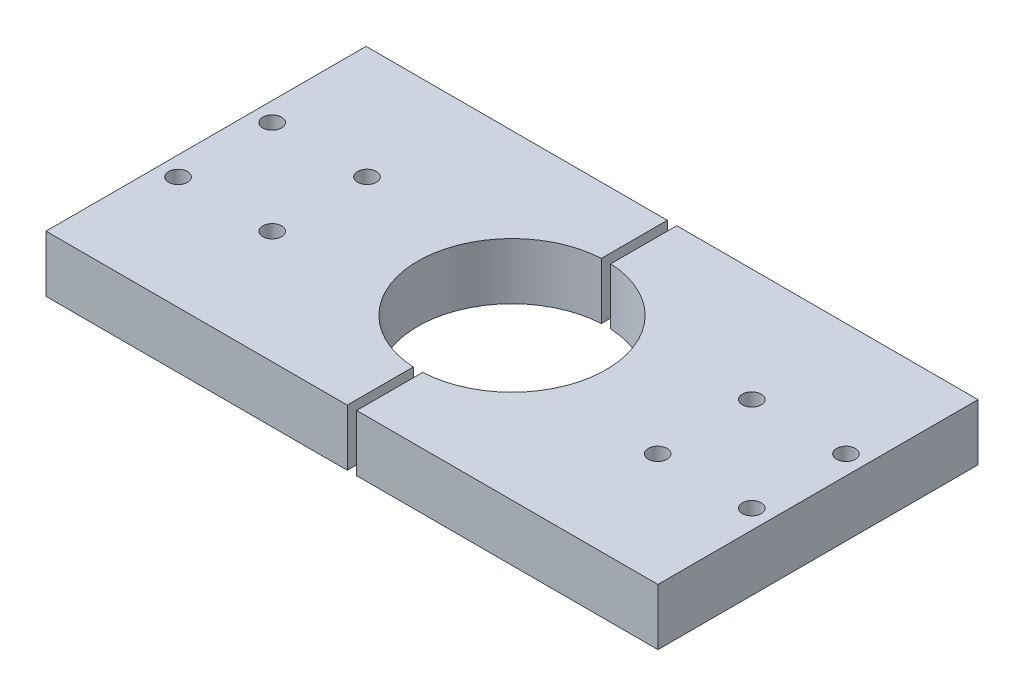
ISO-10303-21;
HEADER;
FILE_DESCRIPTION(('STEP AP214'),'2;1');
FILE_NAME('part.step','',(''),(''),'','','');
FILE_SCHEMA(('AUTOMOTIVE_DESIGN { 1 0 10303 214 1 1 1 1 }'));
ENDSEC;
DATA;
#1=APPLICATION_CONTEXT('core data for automotive mechanical design processes');
#2=APPLICATION_PROTOCOL_DEFINITION('international standard','automotive_design',2000,#1);
#3=PRODUCT_CONTEXT('',#1,'mechanical');
#4=PRODUCT('Part','Part','',(#3));
#5=PRODUCT_RELATED_PRODUCT_CATEGORY('part','',(#4));
#6=PRODUCT_DEFINITION_FORMATION('','',#4);
#7=PRODUCT_DEFINITION_CONTEXT('part definition',#1,'design');
#8=PRODUCT_DEFINITION('design','',#6,#7);
#9=PRODUCT_DEFINITION_SHAPE('','',#8);
#10=(LENGTH_UNIT() NAMED_UNIT(*) SI_UNIT(.MILLI.,.METRE.));
#11=(NAMED_UNIT(*) PLANE_ANGLE_UNIT() SI_UNIT($,.RADIAN.));
#12=(NAMED_UNIT(*) SI_UNIT($,.STERADIAN.) SOLID_ANGLE_UNIT());
#13=UNCERTAINTY_MEASURE_WITH_UNIT(LENGTH_MEASURE(1.E-05),#10,'distance_accuracy_value','');
#14=(GEOMETRIC_REPRESENTATION_CONTEXT(3) GLOBAL_UNCERTAINTY_ASSIGNED_CONTEXT((#13)) GLOBAL_UNIT_ASSIGNED_CONTEXT((#10,
#11,#12)) REPRESENTATION_CONTEXT('',''));
#15=CARTESIAN_POINT('',(0.,0.,0.));
#16=DIRECTION('',(0.,0.,1.));
#17=DIRECTION('',(1.,0.,0.));
#18=AXIS2_PLACEMENT_3D('',#15,#16,#17);
#19=CARTESIAN_POINT('',(65.001,6.,27.));
#20=DIRECTION('',(-1.,0.,0.));
#21=DIRECTION('',(0.,0.,1.));
#22=AXIS2_PLACEMENT_3D('',#19,#20,#21);
#23=CYLINDRICAL_SURFACE('',#22,2.99999999999999);
#24=CARTESIAN_POINT('',(-1.,6.,27.));
#25=DIRECTION('',(-1.,0.,0.));
#26=DIRECTION('',(0.,0.,1.));
#27=AXIS2_PLACEMENT_3D('',#24,#25,#26);
#28=CIRCLE('',#27,2.99999999999999);
#29=CARTESIAN_POINT('',(-1.,6.,30.));
#30=VERTEX_POINT('',#29);
#31=EDGE_CURVE('E159',#30,#30,#28,.F.);
#32=ORIENTED_EDGE('',*,*,#31,.T.);
#33=EDGE_LOOP('',(#32));
#34=FACE_BOUND('',#33,.T.);
#35=CARTESIAN_POINT('',(-59.,6.,27.));
#36=DIRECTION('',(-1.,0.,0.));
#37=DIRECTION('',(0.,0.,1.));
#38=AXIS2_PLACEMENT_3D('',#35,#36,#37);
#39=CIRCLE('',#38,2.99999999999999);
#40=CARTESIAN_POINT('',(-59.,6.,30.));
#41=VERTEX_POINT('',#40);
#42=EDGE_CURVE('E54',#41,#41,#39,.F.);
#43=ORIENTED_EDGE('',*,*,#42,.F.);
#44=EDGE_LOOP('',(#43));
#45=FACE_BOUND('',#44,.T.);
#46=ADVANCED_FACE('F50',(#34,#45),#23,.F.);
#47=CARTESIAN_POINT('',(65.001,6.,-27.));
#48=DIRECTION('',(-1.,0.,0.));
#49=DIRECTION('',(0.,0.,1.));
#50=AXIS2_PLACEMENT_3D('',#47,#48,#49);
#51=CYLINDRICAL_SURFACE('',#50,2.99999999999999);
#52=CARTESIAN_POINT('',(-1.,6.,-27.));
#53=DIRECTION('',(-1.,0.,0.));
#54=DIRECTION('',(0.,0.,1.));
#55=AXIS2_PLACEMENT_3D('',#52,#53,#54);
#56=CIRCLE('',#55,2.99999999999999);
#57=CARTESIAN_POINT('',(-1.,6.,-24.));
#58=VERTEX_POINT('',#57);
#59=EDGE_CURVE('E178',#58,#58,#56,.F.);
#60=ORIENTED_EDGE('',*,*,#59,.T.);
#61=EDGE_LOOP('',(#60));
#62=FACE_BOUND('',#61,.T.);
#63=CARTESIAN_POINT('',(-59.,6.,-27.));
#64=DIRECTION('',(-1.,0.,0.));
#65=DIRECTION('',(0.,0.,1.));
#66=AXIS2_PLACEMENT_3D('',#63,#64,#65);
#67=CIRCLE('',#66,2.99999999999999);
#68=CARTESIAN_POINT('',(-59.,6.,-24.));
#69=VERTEX_POINT('',#68);
#70=EDGE_CURVE('E149',#69,#69,#67,.F.);
#71=ORIENTED_EDGE('',*,*,#70,.F.);
#72=EDGE_LOOP('',(#71));
#73=FACE_BOUND('',#72,.T.);
#74=ADVANCED_FACE('F270',(#62,#73),#51,.F.);
#75=CARTESIAN_POINT('',(-1.,12.,34.));
#76=DIRECTION('',(-1.,0.,0.));
#77=DIRECTION('',(0.,0.,1.));
#78=AXIS2_PLACEMENT_3D('',#75,#76,#77);
#79=PLANE('',#78);
#80=ORIENTED_EDGE('',*,*,#59,.F.);
#81=EDGE_LOOP('',(#80));
#82=FACE_BOUND('',#81,.T.);
#83=DIRECTION('',(0.,-1.,0.));
#84=VECTOR('',#83,1.);
#85=CARTESIAN_POINT('',(-1.,12.,-19.9749843554382));
#86=LINE('',#85,#84);
#87=CARTESIAN_POINT('',(-1.,0.,-19.9749843554382));
#88=VERTEX_POINT('',#87);
#89=CARTESIAN_POINT('',(-1.,12.,-19.9749843554382));
#90=VERTEX_POINT('',#89);
#91=EDGE_CURVE('E114',#88,#90,#86,.F.);
#92=ORIENTED_EDGE('',*,*,#91,.F.);
#93=DIRECTION('',(0.,0.,-1.));
#94=VECTOR('',#93,1.);
#95=CARTESIAN_POINT('',(-1.,0.,34.));
#96=LINE('',#95,#94);
#97=CARTESIAN_POINT('',(-1.,0.,-34.));
#98=VERTEX_POINT('',#97);
#99=EDGE_CURVE('E233',#88,#98,#96,.T.);
#100=ORIENTED_EDGE('',*,*,#99,.T.);
#101=DIRECTION('',(0.,-1.,0.));
#102=VECTOR('',#101,1.);
#103=CARTESIAN_POINT('',(-1.,12.,-34.));
#104=LINE('',#103,#102);
#105=CARTESIAN_POINT('',(-1.,12.,-34.));
#106=VERTEX_POINT('',#105);
#107=EDGE_CURVE('E134',#106,#98,#104,.T.);
#108=ORIENTED_EDGE('',*,*,#107,.F.);
#109=DIRECTION('',(0.,0.,-1.));
#110=VECTOR('',#109,1.);
#111=CARTESIAN_POINT('',(-1.,12.,34.));
#112=LINE('',#111,#110);
#113=EDGE_CURVE('E127',#90,#106,#112,.T.);
#114=ORIENTED_EDGE('',*,*,#113,.F.);
#115=EDGE_LOOP('',(#92,#100,#108,#114));
#116=FACE_BOUND('',#115,.T.);
#117=ADVANCED_FACE('F133',(#82,#116),#79,.F.);
#118=ORIENTED_EDGE('',*,*,#31,.F.);
#119=EDGE_LOOP('',(#118));
#120=FACE_BOUND('',#119,.T.);
#121=DIRECTION('',(0.,-1.,0.));
#122=VECTOR('',#121,1.);
#123=CARTESIAN_POINT('',(-1.,12.,19.9749843554382));
#124=LINE('',#123,#122);
#125=CARTESIAN_POINT('',(-1.,12.,19.9749843554382));
#126=VERTEX_POINT('',#125);
#127=CARTESIAN_POINT('',(-1.,0.,19.9749843554382));
#128=VERTEX_POINT('',#127);
#129=EDGE_CURVE('E68',#126,#128,#124,.T.);
#130=ORIENTED_EDGE('',*,*,#129,.F.);
#131=CARTESIAN_POINT('',(-1.,12.,34.));
#132=VERTEX_POINT('',#131);
#133=EDGE_CURVE('E130',#132,#126,#112,.T.);
#134=ORIENTED_EDGE('',*,*,#133,.F.);
#135=DIRECTION('',(0.,-1.,0.));
#136=VECTOR('',#135,1.);
#137=CARTESIAN_POINT('',(-1.,12.,34.));
#138=LINE('',#137,#136);
#139=CARTESIAN_POINT('',(-1.,0.,34.));
#140=VERTEX_POINT('',#139);
#141=EDGE_CURVE('E223',#132,#140,#138,.T.);
#142=ORIENTED_EDGE('',*,*,#141,.T.);
#143=EDGE_CURVE('E234',#140,#128,#96,.T.);
#144=ORIENTED_EDGE('',*,*,#143,.T.);
#145=EDGE_LOOP('',(#130,#134,#142,#144));
#146=FACE_BOUND('',#145,.T.);
#147=ADVANCED_FACE('F243',(#120,#146),#79,.F.);
#148=CARTESIAN_POINT('',(-65.,12.,34.));
#149=DIRECTION('',(1.,0.,0.));
#150=DIRECTION('',(0.,0.,-1.));
#151=AXIS2_PLACEMENT_3D('',#148,#149,#150);
#152=PLANE('',#151);
#153=CARTESIAN_POINT('',(-65.,6.,-27.));
#154=DIRECTION('',(-1.,0.,0.));
#155=DIRECTION('',(0.,0.,1.));
#156=AXIS2_PLACEMENT_3D('',#153,#154,#155);
#157=CIRCLE('',#156,5.);
#158=CARTESIAN_POINT('',(-65.,6.,-22.));
#159=VERTEX_POINT('',#158);
#160=EDGE_CURVE('E161',#159,#159,#157,.T.);
#161=ORIENTED_EDGE('',*,*,#160,.F.);
#162=EDGE_LOOP('',(#161));
#163=FACE_BOUND('',#162,.T.);
#164=CARTESIAN_POINT('',(-65.,6.,27.));
#165=DIRECTION('',(-1.,0.,0.));
#166=DIRECTION('',(0.,0.,1.));
#167=AXIS2_PLACEMENT_3D('',#164,#165,#166);
#168=CIRCLE('',#167,5.);
#169=CARTESIAN_POINT('',(-65.,6.,32.));
#170=VERTEX_POINT('',#169);
#171=EDGE_CURVE('E168',#170,#170,#168,.T.);
#172=ORIENTED_EDGE('',*,*,#171,.F.);
#173=EDGE_LOOP('',(#172));
#174=FACE_BOUND('',#173,.T.);
#175=DIRECTION('',(0.,0.,1.));
#176=VECTOR('',#175,1.);
#177=CARTESIAN_POINT('',(-65.,0.,34.));
#178=LINE('',#177,#176);
#179=CARTESIAN_POINT('',(-65.,0.,-34.));
#180=VERTEX_POINT('',#179);
#181=CARTESIAN_POINT('',(-65.,0.,34.));
#182=VERTEX_POINT('',#181);
#183=EDGE_CURVE('E12',#180,#182,#178,.T.);
#184=ORIENTED_EDGE('',*,*,#183,.T.);
#185=DIRECTION('',(0.,-1.,0.));
#186=VECTOR('',#185,1.);
#187=CARTESIAN_POINT('',(-65.,12.,34.));
#188=LINE('',#187,#186);
#189=CARTESIAN_POINT('',(-65.,12.,34.));
#190=VERTEX_POINT('',#189);
#191=EDGE_CURVE('E123',#190,#182,#188,.T.);
#192=ORIENTED_EDGE('',*,*,#191,.F.);
#193=DIRECTION('',(0.,0.,1.));
#194=VECTOR('',#193,1.);
#195=CARTESIAN_POINT('',(-65.,12.,34.));
#196=LINE('',#195,#194);
#197=CARTESIAN_POINT('',(-65.,12.,-34.));
#198=VERTEX_POINT('',#197);
#199=EDGE_CURVE('E147',#198,#190,#196,.T.);
#200=ORIENTED_EDGE('',*,*,#199,.F.);
#201=DIRECTION('',(0.,-1.,0.));
#202=VECTOR('',#201,1.);
#203=CARTESIAN_POINT('',(-65.,12.,-34.));
#204=LINE('',#203,#202);
#205=EDGE_CURVE('E142',#198,#180,#204,.T.);
#206=ORIENTED_EDGE('',*,*,#205,.T.);
#207=EDGE_LOOP('',(#184,#192,#200,#206));
#208=FACE_BOUND('',#207,.T.);
#209=ADVANCED_FACE('F255',(#163,#174,#208),#152,.F.);
#210=CARTESIAN_POINT('',(-65.,12.,34.));
#211=DIRECTION('',(0.,0.,-1.));
#212=DIRECTION('',(-1.,0.,0.));
#213=AXIS2_PLACEMENT_3D('',#210,#211,#212);
#214=PLANE('',#213);
#215=DIRECTION('',(1.,0.,0.));
#216=VECTOR('',#215,1.);
#217=CARTESIAN_POINT('',(-65.,0.,34.));
#218=LINE('',#217,#216);
#219=EDGE_CURVE('E60',#182,#140,#218,.T.);
#220=ORIENTED_EDGE('',*,*,#219,.T.);
#221=ORIENTED_EDGE('',*,*,#141,.F.);
#222=DIRECTION('',(1.,0.,0.));
#223=VECTOR('',#222,1.);
#224=CARTESIAN_POINT('',(-65.,12.,34.));
#225=LINE('',#224,#223);
#226=EDGE_CURVE('E96',#190,#132,#225,.T.);
#227=ORIENTED_EDGE('',*,*,#226,.F.);
#228=ORIENTED_EDGE('',*,*,#191,.T.);
#229=EDGE_LOOP('',(#220,#221,#227,#228));
#230=FACE_BOUND('',#229,.T.);
#231=ADVANCED_FACE('F240',(#230),#214,.F.);
#232=CARTESIAN_POINT('',(-65.,12.,-34.));
#233=DIRECTION('',(0.,0.,1.));
#234=DIRECTION('',(1.,0.,0.));
#235=AXIS2_PLACEMENT_3D('',#232,#233,#234);
#236=PLANE('',#235);
#237=DIRECTION('',(-1.,0.,0.));
#238=VECTOR('',#237,1.);
#239=CARTESIAN_POINT('',(-65.,0.,-34.));
#240=LINE('',#239,#238);
#241=EDGE_CURVE('E104',#98,#180,#240,.T.);
#242=ORIENTED_EDGE('',*,*,#241,.T.);
#243=ORIENTED_EDGE('',*,*,#205,.F.);
#244=DIRECTION('',(-1.,0.,0.));
#245=VECTOR('',#244,1.);
#246=CARTESIAN_POINT('',(-65.,12.,-34.));
#247=LINE('',#246,#245);
#248=EDGE_CURVE('E137',#106,#198,#247,.T.);
#249=ORIENTED_EDGE('',*,*,#248,.F.);
#250=ORIENTED_EDGE('',*,*,#107,.T.);
#251=EDGE_LOOP('',(#242,#243,#249,#250));
#252=FACE_BOUND('',#251,.T.);
#253=ADVANCED_FACE('F252',(#252),#236,.F.);
#254=CARTESIAN_POINT('',(0.,12.,0.));
#255=DIRECTION('',(0.,-1.,0.));
#256=DIRECTION('',(0.,0.,-1.));
#257=AXIS2_PLACEMENT_3D('',#254,#255,#256);
#258=PLANE('',#257);
#259=CARTESIAN_POINT('',(-60.95,12.,10.));
#260=DIRECTION('',(0.,1.,0.));
#261=DIRECTION('',(0.,0.,1.));
#262=AXIS2_PLACEMENT_3D('',#259,#260,#261);
#263=CIRCLE('',#262,2.);
#264=CARTESIAN_POINT('',(-60.95,12.,12.));
#265=VERTEX_POINT('',#264);
#266=EDGE_CURVE('E203',#265,#265,#263,.T.);
#267=ORIENTED_EDGE('',*,*,#266,.F.);
#268=EDGE_LOOP('',(#267));
#269=FACE_BOUND('',#268,.T.);
#270=CARTESIAN_POINT('',(-40.95,12.,10.));
#271=DIRECTION('',(0.,1.,0.));
#272=DIRECTION('',(0.,0.,1.));
#273=AXIS2_PLACEMENT_3D('',#270,#271,#272);
#274=CIRCLE('',#273,2.);
#275=CARTESIAN_POINT('',(-40.95,12.,12.));
#276=VERTEX_POINT('',#275);
#277=EDGE_CURVE('E195',#276,#276,#274,.T.);
#278=ORIENTED_EDGE('',*,*,#277,.F.);
#279=EDGE_LOOP('',(#278));
#280=FACE_BOUND('',#279,.T.);
#281=CARTESIAN_POINT('',(-40.8891771545705,12.,-10.082916262143));
#282=DIRECTION('',(0.,1.,0.));
#283=DIRECTION('',(0.,0.,1.));
#284=AXIS2_PLACEMENT_3D('',#281,#282,#283);
#285=CIRCLE('',#284,2.);
#286=CARTESIAN_POINT('',(-40.8891771545705,12.,-8.08291626214301));
#287=VERTEX_POINT('',#286);
#288=EDGE_CURVE('E186',#287,#287,#285,.T.);
#289=ORIENTED_EDGE('',*,*,#288,.F.);
#290=EDGE_LOOP('',(#289));
#291=FACE_BOUND('',#290,.T.);
#292=CARTESIAN_POINT('',(-60.95,12.,-10.));
#293=DIRECTION('',(0.,1.,0.));
#294=DIRECTION('',(0.,0.,1.));
#295=AXIS2_PLACEMENT_3D('',#292,#293,#294);
#296=CIRCLE('',#295,2.);
#297=CARTESIAN_POINT('',(-60.95,12.,-8.));
#298=VERTEX_POINT('',#297);
#299=EDGE_CURVE('E190',#298,#298,#296,.T.);
#300=ORIENTED_EDGE('',*,*,#299,.F.);
#301=EDGE_LOOP('',(#300));
#302=FACE_BOUND('',#301,.T.);
#303=CARTESIAN_POINT('',(0.,12.,0.));
#304=DIRECTION('',(0.,1.,0.));
#305=DIRECTION('',(0.,0.,1.));
#306=AXIS2_PLACEMENT_3D('',#303,#304,#305);
#307=CIRCLE('',#306,20.);
#308=EDGE_CURVE('E117',#90,#126,#307,.T.);
#309=ORIENTED_EDGE('',*,*,#308,.F.);
#310=ORIENTED_EDGE('',*,*,#113,.T.);
#311=ORIENTED_EDGE('',*,*,#248,.T.);
#312=ORIENTED_EDGE('',*,*,#199,.T.);
#313=ORIENTED_EDGE('',*,*,#226,.T.);
#314=ORIENTED_EDGE('',*,*,#133,.T.);
#315=EDGE_LOOP('',(#309,#310,#311,#312,#313,#314));
#316=FACE_BOUND('',#315,.T.);
#317=ADVANCED_FACE('F52',(#269,#280,#291,#302,#316),#258,.F.);
#318=CARTESIAN_POINT('',(0.,0.,0.));
#319=DIRECTION('',(0.,-1.,0.));
#320=DIRECTION('',(0.,0.,-1.));
#321=AXIS2_PLACEMENT_3D('',#318,#319,#320);
#322=PLANE('',#321);
#323=CARTESIAN_POINT('',(-60.95,0.,10.));
#324=DIRECTION('',(0.,1.,0.));
#325=DIRECTION('',(0.,0.,1.));
#326=AXIS2_PLACEMENT_3D('',#323,#324,#325);
#327=CIRCLE('',#326,2.);
#328=CARTESIAN_POINT('',(-60.95,0.,12.));
#329=VERTEX_POINT('',#328);
#330=EDGE_CURVE('E182',#329,#329,#327,.T.);
#331=ORIENTED_EDGE('',*,*,#330,.T.);
#332=EDGE_LOOP('',(#331));
#333=FACE_BOUND('',#332,.T.);
#334=CARTESIAN_POINT('',(-40.95,0.,10.));
#335=DIRECTION('',(0.,1.,0.));
#336=DIRECTION('',(0.,0.,1.));
#337=AXIS2_PLACEMENT_3D('',#334,#335,#336);
#338=CIRCLE('',#337,2.);
#339=CARTESIAN_POINT('',(-40.95,0.,12.));
#340=VERTEX_POINT('',#339);
#341=EDGE_CURVE('E199',#340,#340,#338,.T.);
#342=ORIENTED_EDGE('',*,*,#341,.T.);
#343=EDGE_LOOP('',(#342));
#344=FACE_BOUND('',#343,.T.);
#345=CARTESIAN_POINT('',(-40.8891771545705,0.,-10.082916262143));
#346=DIRECTION('',(0.,1.,0.));
#347=DIRECTION('',(0.,0.,1.));
#348=AXIS2_PLACEMENT_3D('',#345,#346,#347);
#349=CIRCLE('',#348,2.);
#350=CARTESIAN_POINT('',(-40.8891771545705,0.,-8.08291626214301));
#351=VERTEX_POINT('',#350);
#352=EDGE_CURVE('E191',#351,#351,#349,.T.);
#353=ORIENTED_EDGE('',*,*,#352,.T.);
#354=EDGE_LOOP('',(#353));
#355=FACE_BOUND('',#354,.T.);
#356=CARTESIAN_POINT('',(-60.95,0.,-10.));
#357=DIRECTION('',(0.,1.,0.));
#358=DIRECTION('',(0.,0.,1.));
#359=AXIS2_PLACEMENT_3D('',#356,#357,#358);
#360=CIRCLE('',#359,2.);
#361=CARTESIAN_POINT('',(-60.95,0.,-8.));
#362=VERTEX_POINT('',#361);
#363=EDGE_CURVE('E210',#362,#362,#360,.T.);
#364=ORIENTED_EDGE('',*,*,#363,.T.);
#365=EDGE_LOOP('',(#364));
#366=FACE_BOUND('',#365,.T.);
#367=ORIENTED_EDGE('',*,*,#99,.F.);
#368=CARTESIAN_POINT('',(0.,0.,0.));
#369=DIRECTION('',(0.,1.,0.));
#370=DIRECTION('',(0.,0.,1.));
#371=AXIS2_PLACEMENT_3D('',#368,#369,#370);
#372=CIRCLE('',#371,20.);
#373=EDGE_CURVE('E118',#88,#128,#372,.T.);
#374=ORIENTED_EDGE('',*,*,#373,.T.);
#375=ORIENTED_EDGE('',*,*,#143,.F.);
#376=ORIENTED_EDGE('',*,*,#219,.F.);
#377=ORIENTED_EDGE('',*,*,#183,.F.);
#378=ORIENTED_EDGE('',*,*,#241,.F.);
#379=EDGE_LOOP('',(#367,#374,#375,#376,#377,#378));
#380=FACE_BOUND('',#379,.T.);
#381=ADVANCED_FACE('F244',(#333,#344,#355,#366,#380),#322,.T.);
#382=CARTESIAN_POINT('',(0.,12.,0.));
#383=DIRECTION('',(0.,-1.,0.));
#384=DIRECTION('',(0.,0.,-1.));
#385=AXIS2_PLACEMENT_3D('',#382,#383,#384);
#386=CYLINDRICAL_SURFACE('',#385,20.);
#387=ORIENTED_EDGE('',*,*,#91,.T.);
#388=ORIENTED_EDGE('',*,*,#308,.T.);
#389=ORIENTED_EDGE('',*,*,#129,.T.);
#390=ORIENTED_EDGE('',*,*,#373,.F.);
#391=EDGE_LOOP('',(#387,#388,#389,#390));
#392=FACE_BOUND('',#391,.T.);
#393=ADVANCED_FACE('F116',(#392),#386,.F.);
#394=CARTESIAN_POINT('',(-60.95,0.,-10.));
#395=DIRECTION('',(0.,1.,0.));
#396=DIRECTION('',(0.,0.,1.));
#397=AXIS2_PLACEMENT_3D('',#394,#395,#396);
#398=CYLINDRICAL_SURFACE('',#397,2.);
#399=ORIENTED_EDGE('',*,*,#363,.F.);
#400=EDGE_LOOP('',(#399));
#401=FACE_BOUND('',#400,.T.);
#402=ORIENTED_EDGE('',*,*,#299,.T.);
#403=EDGE_LOOP('',(#402));
#404=FACE_BOUND('',#403,.T.);
#405=ADVANCED_FACE('F285',(#401,#404),#398,.F.);
#406=CARTESIAN_POINT('',(-40.8891771545705,0.,-10.082916262143));
#407=DIRECTION('',(0.,1.,0.));
#408=DIRECTION('',(0.,0.,1.));
#409=AXIS2_PLACEMENT_3D('',#406,#407,#408);
#410=CYLINDRICAL_SURFACE('',#409,2.);
#411=ORIENTED_EDGE('',*,*,#352,.F.);
#412=EDGE_LOOP('',(#411));
#413=FACE_BOUND('',#412,.T.);
#414=ORIENTED_EDGE('',*,*,#288,.T.);
#415=EDGE_LOOP('',(#414));
#416=FACE_BOUND('',#415,.T.);
#417=ADVANCED_FACE('F281',(#413,#416),#410,.F.);
#418=CARTESIAN_POINT('',(-40.95,0.,10.));
#419=DIRECTION('',(0.,1.,0.));
#420=DIRECTION('',(0.,0.,1.));
#421=AXIS2_PLACEMENT_3D('',#418,#419,#420);
#422=CYLINDRICAL_SURFACE('',#421,2.);
#423=ORIENTED_EDGE('',*,*,#341,.F.);
#424=EDGE_LOOP('',(#423));
#425=FACE_BOUND('',#424,.T.);
#426=ORIENTED_EDGE('',*,*,#277,.T.);
#427=EDGE_LOOP('',(#426));
#428=FACE_BOUND('',#427,.T.);
#429=ADVANCED_FACE('F284',(#425,#428),#422,.F.);
#430=CARTESIAN_POINT('',(-60.95,0.,10.));
#431=DIRECTION('',(0.,1.,0.));
#432=DIRECTION('',(0.,0.,1.));
#433=AXIS2_PLACEMENT_3D('',#430,#431,#432);
#434=CYLINDRICAL_SURFACE('',#433,2.);
#435=ORIENTED_EDGE('',*,*,#330,.F.);
#436=EDGE_LOOP('',(#435));
#437=FACE_BOUND('',#436,.T.);
#438=ORIENTED_EDGE('',*,*,#266,.T.);
#439=EDGE_LOOP('',(#438));
#440=FACE_BOUND('',#439,.T.);
#441=ADVANCED_FACE('F289',(#437,#440),#434,.F.);
#442=CARTESIAN_POINT('',(-59.,6.,-27.));
#443=DIRECTION('',(-1.,0.,0.));
#444=DIRECTION('',(0.,0.,1.));
#445=AXIS2_PLACEMENT_3D('',#442,#443,#444);
#446=PLANE('',#445);
#447=CARTESIAN_POINT('',(-59.,6.,-27.));
#448=DIRECTION('',(-1.,0.,0.));
#449=DIRECTION('',(0.,0.,1.));
#450=AXIS2_PLACEMENT_3D('',#447,#448,#449);
#451=CIRCLE('',#450,5.);
#452=CARTESIAN_POINT('',(-59.,6.,-22.));
#453=VERTEX_POINT('',#452);
#454=EDGE_CURVE('E152',#453,#453,#451,.T.);
#455=ORIENTED_EDGE('',*,*,#454,.T.);
#456=EDGE_LOOP('',(#455));
#457=FACE_BOUND('',#456,.T.);
#458=ORIENTED_EDGE('',*,*,#70,.T.);
#459=EDGE_LOOP('',(#458));
#460=FACE_BOUND('',#459,.T.);
#461=ADVANCED_FACE('F293',(#457,#460),#446,.T.);
#462=CARTESIAN_POINT('',(-59.,6.,-27.));
#463=DIRECTION('',(-1.,0.,0.));
#464=DIRECTION('',(0.,0.,1.));
#465=AXIS2_PLACEMENT_3D('',#462,#463,#464);
#466=CYLINDRICAL_SURFACE('',#465,5.);
#467=ORIENTED_EDGE('',*,*,#454,.F.);
#468=EDGE_LOOP('',(#467));
#469=FACE_BOUND('',#468,.T.);
#470=ORIENTED_EDGE('',*,*,#160,.T.);
#471=EDGE_LOOP('',(#470));
#472=FACE_BOUND('',#471,.T.);
#473=ADVANCED_FACE('F348',(#469,#472),#466,.F.);
#474=CARTESIAN_POINT('',(-59.,6.,27.));
#475=DIRECTION('',(-1.,0.,0.));
#476=DIRECTION('',(0.,0.,1.));
#477=AXIS2_PLACEMENT_3D('',#474,#475,#476);
#478=PLANE('',#477);
#479=CARTESIAN_POINT('',(-59.,6.,27.));
#480=DIRECTION('',(-1.,0.,0.));
#481=DIRECTION('',(0.,0.,1.));
#482=AXIS2_PLACEMENT_3D('',#479,#480,#481);
#483=CIRCLE('',#482,5.);
#484=CARTESIAN_POINT('',(-59.,6.,32.));
#485=VERTEX_POINT('',#484);
#486=EDGE_CURVE('E174',#485,#485,#483,.T.);
#487=ORIENTED_EDGE('',*,*,#486,.T.);
#488=EDGE_LOOP('',(#487));
#489=FACE_BOUND('',#488,.T.);
#490=ORIENTED_EDGE('',*,*,#42,.T.);
#491=EDGE_LOOP('',(#490));
#492=FACE_BOUND('',#491,.T.);
#493=ADVANCED_FACE('F357',(#489,#492),#478,.T.);
#494=CARTESIAN_POINT('',(-59.,6.,27.));
#495=DIRECTION('',(-1.,0.,0.));
#496=DIRECTION('',(0.,0.,1.));
#497=AXIS2_PLACEMENT_3D('',#494,#495,#496);
#498=CYLINDRICAL_SURFACE('',#497,5.);
#499=ORIENTED_EDGE('',*,*,#486,.F.);
#500=EDGE_LOOP('',(#499));
#501=FACE_BOUND('',#500,.T.);
#502=ORIENTED_EDGE('',*,*,#171,.T.);
#503=EDGE_LOOP('',(#502));
#504=FACE_BOUND('',#503,.T.);
#505=ADVANCED_FACE('F368',(#501,#504),#498,.F.);
#506=CLOSED_SHELL('',(#46,#74,#117,#147,#209,#231,#253,#317,#381,#393,#405,#417,#429,#441,#461,
#473,#493,#505));
#507=MANIFOLD_SOLID_BREP('B2',#506);
#508=CARTESIAN_POINT('',(0.999999999999999,12.,34.));
#509=DIRECTION('',(1.,0.,0.));
#510=DIRECTION('',(0.,0.,-1.));
#511=AXIS2_PLACEMENT_3D('',#508,#509,#510);
#512=PLANE('',#511);
#513=CARTESIAN_POINT('',(0.999999999999999,6.,27.));
#514=DIRECTION('',(-1.,0.,0.));
#515=DIRECTION('',(0.,0.,-1.));
#516=AXIS2_PLACEMENT_3D('',#513,#514,#515);
#517=CIRCLE('',#516,2.5);
#518=CARTESIAN_POINT('',(0.999999999999999,6.,24.5));
#519=VERTEX_POINT('',#518);
#520=EDGE_CURVE('E718',#519,#519,#517,.T.);
#521=ORIENTED_EDGE('',*,*,#520,.F.);
#522=EDGE_LOOP('',(#521));
#523=FACE_BOUND('',#522,.T.);
#524=DIRECTION('',(0.,-1.,0.));
#525=VECTOR('',#524,1.);
#526=CARTESIAN_POINT('',(0.999999999999999,12.,19.9749843554382));
#527=LINE('',#526,#525);
#528=CARTESIAN_POINT('',(0.999999999999999,0.,19.9749843554382));
#529=VERTEX_POINT('',#528);
#530=CARTESIAN_POINT('',(0.999999999999999,12.,19.9749843554382));
#531=VERTEX_POINT('',#530);
#532=EDGE_CURVE('E573',#529,#531,#527,.F.);
#533=ORIENTED_EDGE('',*,*,#532,.F.);
#534=DIRECTION('',(0.,0.,1.));
#535=VECTOR('',#534,1.);
#536=CARTESIAN_POINT('',(0.999999999999999,0.,34.));
#537=LINE('',#536,#535);
#538=CARTESIAN_POINT('',(0.999999999999999,0.,34.));
#539=VERTEX_POINT('',#538);
#540=EDGE_CURVE('E611',#529,#539,#537,.T.);
#541=ORIENTED_EDGE('',*,*,#540,.T.);
#542=DIRECTION('',(0.,-1.,0.));
#543=VECTOR('',#542,1.);
#544=CARTESIAN_POINT('',(0.999999999999999,12.,34.));
#545=LINE('',#544,#543);
#546=CARTESIAN_POINT('',(0.999999999999999,12.,34.));
#547=VERTEX_POINT('',#546);
#548=EDGE_CURVE('E592',#547,#539,#545,.T.);
#549=ORIENTED_EDGE('',*,*,#548,.F.);
#550=DIRECTION('',(0.,0.,1.));
#551=VECTOR('',#550,1.);
#552=CARTESIAN_POINT('',(0.999999999999999,12.,34.));
#553=LINE('',#552,#551);
#554=EDGE_CURVE('E586',#531,#547,#553,.T.);
#555=ORIENTED_EDGE('',*,*,#554,.F.);
#556=EDGE_LOOP('',(#533,#541,#549,#555));
#557=FACE_BOUND('',#556,.T.);
#558=ADVANCED_FACE('F512',(#523,#557),#512,.F.);
#559=CARTESIAN_POINT('',(0.999999999999999,6.,-27.));
#560=DIRECTION('',(-1.,0.,0.));
#561=DIRECTION('',(0.,0.,1.));
#562=AXIS2_PLACEMENT_3D('',#559,#560,#561);
#563=CIRCLE('',#562,2.5);
#564=CARTESIAN_POINT('',(0.999999999999999,6.,-24.5));
#565=VERTEX_POINT('',#564);
#566=EDGE_CURVE('E709',#565,#565,#563,.T.);
#567=ORIENTED_EDGE('',*,*,#566,.F.);
#568=EDGE_LOOP('',(#567));
#569=FACE_BOUND('',#568,.T.);
#570=DIRECTION('',(0.,-1.,0.));
#571=VECTOR('',#570,1.);
#572=CARTESIAN_POINT('',(0.999999999999999,12.,-19.9749843554382));
#573=LINE('',#572,#571);
#574=CARTESIAN_POINT('',(0.999999999999999,12.,-19.9749843554382));
#575=VERTEX_POINT('',#574);
#576=CARTESIAN_POINT('',(0.999999999999999,0.,-19.9749843554382));
#577=VERTEX_POINT('',#576);
#578=EDGE_CURVE('E528',#575,#577,#573,.T.);
#579=ORIENTED_EDGE('',*,*,#578,.F.);
#580=CARTESIAN_POINT('',(0.999999999999999,12.,-34.));
#581=VERTEX_POINT('',#580);
#582=EDGE_CURVE('E589',#581,#575,#553,.T.);
#583=ORIENTED_EDGE('',*,*,#582,.F.);
#584=DIRECTION('',(0.,-1.,0.));
#585=VECTOR('',#584,1.);
#586=CARTESIAN_POINT('',(0.999999999999999,12.,-34.));
#587=LINE('',#586,#585);
#588=CARTESIAN_POINT('',(0.999999999999999,0.,-34.));
#589=VERTEX_POINT('',#588);
#590=EDGE_CURVE('E521',#581,#589,#587,.T.);
#591=ORIENTED_EDGE('',*,*,#590,.T.);
#592=EDGE_CURVE('E612',#589,#577,#537,.T.);
#593=ORIENTED_EDGE('',*,*,#592,.T.);
#594=EDGE_LOOP('',(#579,#583,#591,#593));
#595=FACE_BOUND('',#594,.T.);
#596=ADVANCED_FACE('F626',(#569,#595),#512,.F.);
#597=CARTESIAN_POINT('',(65.,12.,34.));
#598=DIRECTION('',(-1.,0.,0.));
#599=DIRECTION('',(0.,0.,1.));
#600=AXIS2_PLACEMENT_3D('',#597,#598,#599);
#601=PLANE('',#600);
#602=DIRECTION('',(0.,0.,-1.));
#603=VECTOR('',#602,1.);
#604=CARTESIAN_POINT('',(65.,0.,34.));
#605=LINE('',#604,#603);
#606=CARTESIAN_POINT('',(65.,0.,34.));
#607=VERTEX_POINT('',#606);
#608=CARTESIAN_POINT('',(65.,0.,-34.));
#609=VERTEX_POINT('',#608);
#610=EDGE_CURVE('E582',#607,#609,#605,.T.);
#611=ORIENTED_EDGE('',*,*,#610,.T.);
#612=DIRECTION('',(0.,-1.,0.));
#613=VECTOR('',#612,1.);
#614=CARTESIAN_POINT('',(65.,12.,-34.));
#615=LINE('',#614,#613);
#616=CARTESIAN_POINT('',(65.,12.,-34.));
#617=VERTEX_POINT('',#616);
#618=EDGE_CURVE('E48',#617,#609,#615,.T.);
#619=ORIENTED_EDGE('',*,*,#618,.F.);
#620=DIRECTION('',(0.,0.,-1.));
#621=VECTOR('',#620,1.);
#622=CARTESIAN_POINT('',(65.,12.,34.));
#623=LINE('',#622,#621);
#624=CARTESIAN_POINT('',(65.,12.,34.));
#625=VERTEX_POINT('',#624);
#626=EDGE_CURVE('E598',#625,#617,#623,.T.);
#627=ORIENTED_EDGE('',*,*,#626,.F.);
#628=DIRECTION('',(0.,-1.,0.));
#629=VECTOR('',#628,1.);
#630=CARTESIAN_POINT('',(65.,12.,34.));
#631=LINE('',#630,#629);
#632=EDGE_CURVE('E604',#625,#607,#631,.T.);
#633=ORIENTED_EDGE('',*,*,#632,.T.);
#634=EDGE_LOOP('',(#611,#619,#627,#633));
#635=FACE_BOUND('',#634,.T.);
#636=ADVANCED_FACE('F514',(#635),#601,.F.);
#637=CARTESIAN_POINT('',(0.999999999999999,12.,-34.));
#638=DIRECTION('',(0.,0.,1.));
#639=DIRECTION('',(1.,0.,0.));
#640=AXIS2_PLACEMENT_3D('',#637,#638,#639);
#641=PLANE('',#640);
#642=DIRECTION('',(-1.,0.,0.));
#643=VECTOR('',#642,1.);
#644=CARTESIAN_POINT('',(0.999999999999999,0.,-34.));
#645=LINE('',#644,#643);
#646=EDGE_CURVE('E608',#609,#589,#645,.T.);
#647=ORIENTED_EDGE('',*,*,#646,.T.);
#648=ORIENTED_EDGE('',*,*,#590,.F.);
#649=DIRECTION('',(-1.,0.,0.));
#650=VECTOR('',#649,1.);
#651=CARTESIAN_POINT('',(0.999999999999999,12.,-34.));
#652=LINE('',#651,#650);
#653=EDGE_CURVE('E565',#617,#581,#652,.T.);
#654=ORIENTED_EDGE('',*,*,#653,.F.);
#655=ORIENTED_EDGE('',*,*,#618,.T.);
#656=EDGE_LOOP('',(#647,#648,#654,#655));
#657=FACE_BOUND('',#656,.T.);
#658=ADVANCED_FACE('F646',(#657),#641,.F.);
#659=CARTESIAN_POINT('',(0.999999999999999,12.,34.));
#660=DIRECTION('',(0.,0.,-1.));
#661=DIRECTION('',(-1.,0.,0.));
#662=AXIS2_PLACEMENT_3D('',#659,#660,#661);
#663=PLANE('',#662);
#664=DIRECTION('',(1.,0.,0.));
#665=VECTOR('',#664,1.);
#666=CARTESIAN_POINT('',(0.999999999999999,0.,34.));
#667=LINE('',#666,#665);
#668=EDGE_CURVE('E558',#539,#607,#667,.T.);
#669=ORIENTED_EDGE('',*,*,#668,.T.);
#670=ORIENTED_EDGE('',*,*,#632,.F.);
#671=DIRECTION('',(1.,0.,0.));
#672=VECTOR('',#671,1.);
#673=CARTESIAN_POINT('',(0.999999999999999,12.,34.));
#674=LINE('',#673,#672);
#675=EDGE_CURVE('E537',#547,#625,#674,.T.);
#676=ORIENTED_EDGE('',*,*,#675,.F.);
#677=ORIENTED_EDGE('',*,*,#548,.T.);
#678=EDGE_LOOP('',(#669,#670,#676,#677));
#679=FACE_BOUND('',#678,.T.);
#680=ADVANCED_FACE('F648',(#679),#663,.F.);
#681=CARTESIAN_POINT('',(0.,12.,0.));
#682=DIRECTION('',(0.,-1.,0.));
#683=DIRECTION('',(0.,0.,-1.));
#684=AXIS2_PLACEMENT_3D('',#681,#682,#683);
#685=PLANE('',#684);
#686=CARTESIAN_POINT('',(40.95,12.,10.));
#687=DIRECTION('',(0.,1.,0.));
#688=DIRECTION('',(0.,0.,1.));
#689=AXIS2_PLACEMENT_3D('',#686,#687,#688);
#690=CIRCLE('',#689,2.);
#691=CARTESIAN_POINT('',(40.95,12.,12.));
#692=VERTEX_POINT('',#691);
#693=EDGE_CURVE('E715',#692,#692,#690,.T.);
#694=ORIENTED_EDGE('',*,*,#693,.F.);
#695=EDGE_LOOP('',(#694));
#696=FACE_BOUND('',#695,.T.);
#697=CARTESIAN_POINT('',(60.95,12.,10.));
#698=DIRECTION('',(0.,1.,0.));
#699=DIRECTION('',(0.,0.,1.));
#700=AXIS2_PLACEMENT_3D('',#697,#698,#699);
#701=CIRCLE('',#700,2.);
#702=CARTESIAN_POINT('',(60.95,12.,12.));
#703=VERTEX_POINT('',#702);
#704=EDGE_CURVE('E736',#703,#703,#701,.T.);
#705=ORIENTED_EDGE('',*,*,#704,.F.);
#706=EDGE_LOOP('',(#705));
#707=FACE_BOUND('',#706,.T.);
#708=CARTESIAN_POINT('',(60.95,12.,-10.));
#709=DIRECTION('',(0.,1.,0.));
#710=DIRECTION('',(0.,0.,1.));
#711=AXIS2_PLACEMENT_3D('',#708,#709,#710);
#712=CIRCLE('',#711,2.);
#713=CARTESIAN_POINT('',(60.95,12.,-8.));
#714=VERTEX_POINT('',#713);
#715=EDGE_CURVE('E728',#714,#714,#712,.T.);
#716=ORIENTED_EDGE('',*,*,#715,.F.);
#717=EDGE_LOOP('',(#716));
#718=FACE_BOUND('',#717,.T.);
#719=CARTESIAN_POINT('',(40.95,12.,-10.));
#720=DIRECTION('',(0.,1.,0.));
#721=DIRECTION('',(0.,0.,1.));
#722=AXIS2_PLACEMENT_3D('',#719,#720,#721);
#723=CIRCLE('',#722,2.);
#724=CARTESIAN_POINT('',(40.95,12.,-8.));
#725=VERTEX_POINT('',#724);
#726=EDGE_CURVE('E636',#725,#725,#723,.T.);
#727=ORIENTED_EDGE('',*,*,#726,.F.);
#728=EDGE_LOOP('',(#727));
#729=FACE_BOUND('',#728,.T.);
#730=CARTESIAN_POINT('',(0.,12.,0.));
#731=DIRECTION('',(0.,1.,0.));
#732=DIRECTION('',(0.,0.,1.));
#733=AXIS2_PLACEMENT_3D('',#730,#731,#732);
#734=CIRCLE('',#733,20.);
#735=EDGE_CURVE('E576',#531,#575,#734,.T.);
#736=ORIENTED_EDGE('',*,*,#735,.F.);
#737=ORIENTED_EDGE('',*,*,#554,.T.);
#738=ORIENTED_EDGE('',*,*,#675,.T.);
#739=ORIENTED_EDGE('',*,*,#626,.T.);
#740=ORIENTED_EDGE('',*,*,#653,.T.);
#741=ORIENTED_EDGE('',*,*,#582,.T.);
#742=EDGE_LOOP('',(#736,#737,#738,#739,#740,#741));
#743=FACE_BOUND('',#742,.T.);
#744=ADVANCED_FACE('F585',(#696,#707,#718,#729,#743),#685,.F.);
#745=CARTESIAN_POINT('',(0.,0.,0.));
#746=DIRECTION('',(0.,-1.,0.));
#747=DIRECTION('',(0.,0.,-1.));
#748=AXIS2_PLACEMENT_3D('',#745,#746,#747);
#749=PLANE('',#748);
#750=CARTESIAN_POINT('',(40.95,0.,10.));
#751=DIRECTION('',(0.,1.,0.));
#752=DIRECTION('',(0.,0.,1.));
#753=AXIS2_PLACEMENT_3D('',#750,#751,#752);
#754=CIRCLE('',#753,2.);
#755=CARTESIAN_POINT('',(40.95,0.,12.));
#756=VERTEX_POINT('',#755);
#757=EDGE_CURVE('E708',#756,#756,#754,.T.);
#758=ORIENTED_EDGE('',*,*,#757,.T.);
#759=EDGE_LOOP('',(#758));
#760=FACE_BOUND('',#759,.T.);
#761=CARTESIAN_POINT('',(60.95,0.,10.));
#762=DIRECTION('',(0.,1.,0.));
#763=DIRECTION('',(0.,0.,1.));
#764=AXIS2_PLACEMENT_3D('',#761,#762,#763);
#765=CIRCLE('',#764,2.);
#766=CARTESIAN_POINT('',(60.95,0.,12.));
#767=VERTEX_POINT('',#766);
#768=EDGE_CURVE('E740',#767,#767,#765,.T.);
#769=ORIENTED_EDGE('',*,*,#768,.T.);
#770=EDGE_LOOP('',(#769));
#771=FACE_BOUND('',#770,.T.);
#772=CARTESIAN_POINT('',(60.95,0.,-10.));
#773=DIRECTION('',(0.,1.,0.));
#774=DIRECTION('',(0.,0.,1.));
#775=AXIS2_PLACEMENT_3D('',#772,#773,#774);
#776=CIRCLE('',#775,2.);
#777=CARTESIAN_POINT('',(60.95,0.,-8.));
#778=VERTEX_POINT('',#777);
#779=EDGE_CURVE('E732',#778,#778,#776,.T.);
#780=ORIENTED_EDGE('',*,*,#779,.T.);
#781=EDGE_LOOP('',(#780));
#782=FACE_BOUND('',#781,.T.);
#783=CARTESIAN_POINT('',(40.95,0.,-10.));
#784=DIRECTION('',(0.,1.,0.));
#785=DIRECTION('',(0.,0.,1.));
#786=AXIS2_PLACEMENT_3D('',#783,#784,#785);
#787=CIRCLE('',#786,2.);
#788=CARTESIAN_POINT('',(40.95,0.,-8.));
#789=VERTEX_POINT('',#788);
#790=EDGE_CURVE('E631',#789,#789,#787,.T.);
#791=ORIENTED_EDGE('',*,*,#790,.T.);
#792=EDGE_LOOP('',(#791));
#793=FACE_BOUND('',#792,.T.);
#794=ORIENTED_EDGE('',*,*,#540,.F.);
#795=CARTESIAN_POINT('',(0.,0.,0.));
#796=DIRECTION('',(0.,1.,0.));
#797=DIRECTION('',(0.,0.,1.));
#798=AXIS2_PLACEMENT_3D('',#795,#796,#797);
#799=CIRCLE('',#798,20.);
#800=EDGE_CURVE('E577',#529,#577,#799,.T.);
#801=ORIENTED_EDGE('',*,*,#800,.T.);
#802=ORIENTED_EDGE('',*,*,#592,.F.);
#803=ORIENTED_EDGE('',*,*,#646,.F.);
#804=ORIENTED_EDGE('',*,*,#610,.F.);
#805=ORIENTED_EDGE('',*,*,#668,.F.);
#806=EDGE_LOOP('',(#794,#801,#802,#803,#804,#805));
#807=FACE_BOUND('',#806,.T.);
#808=ADVANCED_FACE('F628',(#760,#771,#782,#793,#807),#749,.T.);
#809=CARTESIAN_POINT('',(0.,12.,0.));
#810=DIRECTION('',(0.,-1.,0.));
#811=DIRECTION('',(0.,0.,-1.));
#812=AXIS2_PLACEMENT_3D('',#809,#810,#811);
#813=CYLINDRICAL_SURFACE('',#812,20.);
#814=ORIENTED_EDGE('',*,*,#532,.T.);
#815=ORIENTED_EDGE('',*,*,#735,.T.);
#816=ORIENTED_EDGE('',*,*,#578,.T.);
#817=ORIENTED_EDGE('',*,*,#800,.F.);
#818=EDGE_LOOP('',(#814,#815,#816,#817));
#819=FACE_BOUND('',#818,.T.);
#820=ADVANCED_FACE('F575',(#819),#813,.F.);
#821=CARTESIAN_POINT('',(40.95,0.,-10.));
#822=DIRECTION('',(0.,1.,0.));
#823=DIRECTION('',(0.,0.,1.));
#824=AXIS2_PLACEMENT_3D('',#821,#822,#823);
#825=CYLINDRICAL_SURFACE('',#824,2.);
#826=ORIENTED_EDGE('',*,*,#790,.F.);
#827=EDGE_LOOP('',(#826));
#828=FACE_BOUND('',#827,.T.);
#829=ORIENTED_EDGE('',*,*,#726,.T.);
#830=EDGE_LOOP('',(#829));
#831=FACE_BOUND('',#830,.T.);
#832=ADVANCED_FACE('F671',(#828,#831),#825,.F.);
#833=CARTESIAN_POINT('',(60.95,0.,-10.));
#834=DIRECTION('',(0.,1.,0.));
#835=DIRECTION('',(0.,0.,1.));
#836=AXIS2_PLACEMENT_3D('',#833,#834,#835);
#837=CYLINDRICAL_SURFACE('',#836,2.);
#838=ORIENTED_EDGE('',*,*,#779,.F.);
#839=EDGE_LOOP('',(#838));
#840=FACE_BOUND('',#839,.T.);
#841=ORIENTED_EDGE('',*,*,#715,.T.);
#842=EDGE_LOOP('',(#841));
#843=FACE_BOUND('',#842,.T.);
#844=ADVANCED_FACE('F674',(#840,#843),#837,.F.);
#845=CARTESIAN_POINT('',(60.95,0.,10.));
#846=DIRECTION('',(0.,1.,0.));
#847=DIRECTION('',(0.,0.,1.));
#848=AXIS2_PLACEMENT_3D('',#845,#846,#847);
#849=CYLINDRICAL_SURFACE('',#848,2.);
#850=ORIENTED_EDGE('',*,*,#768,.F.);
#851=EDGE_LOOP('',(#850));
#852=FACE_BOUND('',#851,.T.);
#853=ORIENTED_EDGE('',*,*,#704,.T.);
#854=EDGE_LOOP('',(#853));
#855=FACE_BOUND('',#854,.T.);
#856=ADVANCED_FACE('F680',(#852,#855),#849,.F.);
#857=CARTESIAN_POINT('',(40.95,0.,10.));
#858=DIRECTION('',(0.,1.,0.));
#859=DIRECTION('',(0.,0.,1.));
#860=AXIS2_PLACEMENT_3D('',#857,#858,#859);
#861=CYLINDRICAL_SURFACE('',#860,2.);
#862=ORIENTED_EDGE('',*,*,#757,.F.);
#863=EDGE_LOOP('',(#862));
#864=FACE_BOUND('',#863,.T.);
#865=ORIENTED_EDGE('',*,*,#693,.T.);
#866=EDGE_LOOP('',(#865));
#867=FACE_BOUND('',#866,.T.);
#868=ADVANCED_FACE('F676',(#864,#867),#861,.F.);
#869=CARTESIAN_POINT('',(26.,6.,-27.));
#870=DIRECTION('',(-1.,0.,0.));
#871=DIRECTION('',(0.,0.,1.));
#872=AXIS2_PLACEMENT_3D('',#869,#870,#871);
#873=CYLINDRICAL_SURFACE('',#872,2.5);
#874=CARTESIAN_POINT('',(26.,6.,-27.));
#875=DIRECTION('',(-1.,0.,0.));
#876=DIRECTION('',(0.,0.,1.));
#877=AXIS2_PLACEMENT_3D('',#874,#875,#876);
#878=CIRCLE('',#877,2.5);
#879=CARTESIAN_POINT('',(26.,6.,-24.5));
#880=VERTEX_POINT('',#879);
#881=EDGE_CURVE('E706',#880,#880,#878,.T.);
#882=ORIENTED_EDGE('',*,*,#881,.F.);
#883=EDGE_LOOP('',(#882));
#884=FACE_BOUND('',#883,.T.);
#885=ORIENTED_EDGE('',*,*,#566,.T.);
#886=EDGE_LOOP('',(#885));
#887=FACE_BOUND('',#886,.T.);
#888=ADVANCED_FACE('F679',(#884,#887),#873,.F.);
#889=CARTESIAN_POINT('',(26.,6.,-27.));
#890=DIRECTION('',(-1.,0.,0.));
#891=DIRECTION('',(0.,0.,1.));
#892=AXIS2_PLACEMENT_3D('',#889,#890,#891);
#893=PLANE('',#892);
#894=ORIENTED_EDGE('',*,*,#881,.T.);
#895=EDGE_LOOP('',(#894));
#896=FACE_BOUND('',#895,.T.);
#897=ADVANCED_FACE('F695',(#896),#893,.T.);
#898=CARTESIAN_POINT('',(26.,6.,27.));
#899=DIRECTION('',(-1.,0.,0.));
#900=DIRECTION('',(0.,0.,1.));
#901=AXIS2_PLACEMENT_3D('',#898,#899,#900);
#902=CYLINDRICAL_SURFACE('',#901,2.5);
#903=CARTESIAN_POINT('',(26.,6.,27.));
#904=DIRECTION('',(-1.,0.,0.));
#905=DIRECTION('',(0.,0.,-1.));
#906=AXIS2_PLACEMENT_3D('',#903,#904,#905);
#907=CIRCLE('',#906,2.5);
#908=CARTESIAN_POINT('',(26.,6.,24.5));
#909=VERTEX_POINT('',#908);
#910=EDGE_CURVE('E724',#909,#909,#907,.T.);
#911=ORIENTED_EDGE('',*,*,#910,.F.);
#912=EDGE_LOOP('',(#911));
#913=FACE_BOUND('',#912,.T.);
#914=ORIENTED_EDGE('',*,*,#520,.T.);
#915=EDGE_LOOP('',(#914));
#916=FACE_BOUND('',#915,.T.);
#917=ADVANCED_FACE('F691',(#913,#916),#902,.F.);
#918=CARTESIAN_POINT('',(26.,6.,27.));
#919=DIRECTION('',(1.,0.,0.));
#920=DIRECTION('',(0.,0.,-1.));
#921=AXIS2_PLACEMENT_3D('',#918,#919,#920);
#922=PLANE('',#921);
#923=ORIENTED_EDGE('',*,*,#910,.T.);
#924=EDGE_LOOP('',(#923));
#925=FACE_BOUND('',#924,.T.);
#926=ADVANCED_FACE('F688',(#925),#922,.F.);
#927=CLOSED_SHELL('',(#558,#596,#636,#658,#680,#744,#808,#820,#832,#844,#856,#868,#888,#897,
#917,#926));
#928=MANIFOLD_SOLID_BREP('B6',#927);
#929=ADVANCED_BREP_SHAPE_REPRESENTATION('',(#18,#507,#928),#14);
#930=SHAPE_DEFINITION_REPRESENTATION(#9,#929);
ENDSEC;
END-ISO-10303-21;
